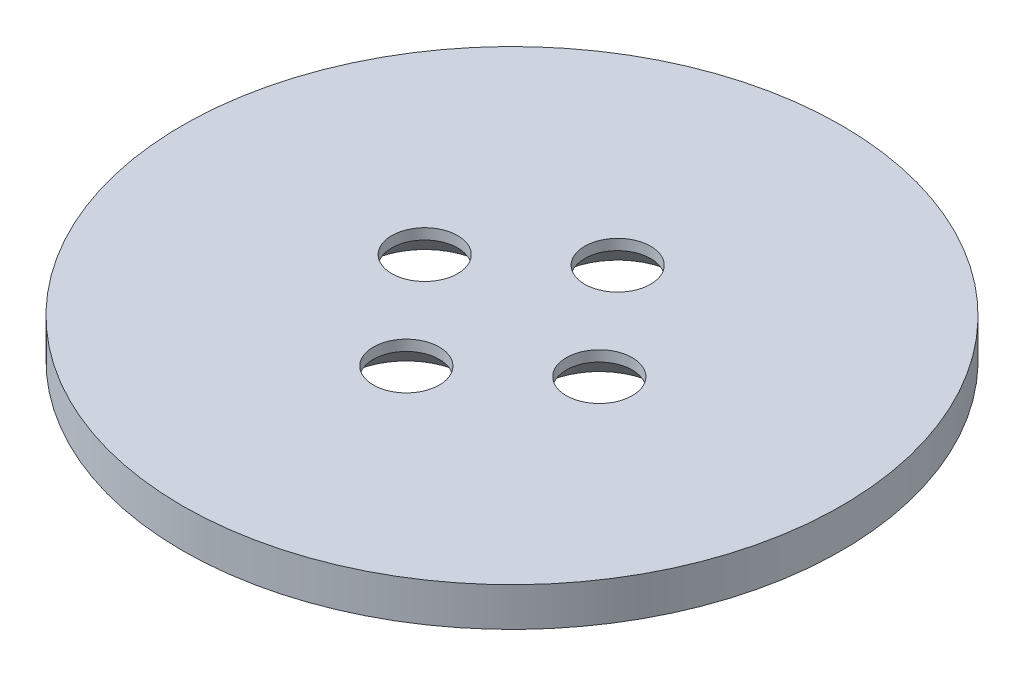
ISO-10303-21;
HEADER;
FILE_DESCRIPTION(('STEP AP214'),'2;1');
FILE_NAME('part.step','',(''),(''),'','','');
FILE_SCHEMA(('AUTOMOTIVE_DESIGN { 1 0 10303 214 1 1 1 1 }'));
ENDSEC;
DATA;
#1=APPLICATION_CONTEXT('core data for automotive mechanical design processes');
#2=APPLICATION_PROTOCOL_DEFINITION('international standard','automotive_design',2000,#1);
#3=PRODUCT_CONTEXT('',#1,'mechanical');
#4=PRODUCT('Part','Part','',(#3));
#5=PRODUCT_RELATED_PRODUCT_CATEGORY('part','',(#4));
#6=PRODUCT_DEFINITION_FORMATION('','',#4);
#7=PRODUCT_DEFINITION_CONTEXT('part definition',#1,'design');
#8=PRODUCT_DEFINITION('design','',#6,#7);
#9=PRODUCT_DEFINITION_SHAPE('','',#8);
#10=(LENGTH_UNIT() NAMED_UNIT(*) SI_UNIT(.MILLI.,.METRE.));
#11=(NAMED_UNIT(*) PLANE_ANGLE_UNIT() SI_UNIT($,.RADIAN.));
#12=(NAMED_UNIT(*) SI_UNIT($,.STERADIAN.) SOLID_ANGLE_UNIT());
#13=UNCERTAINTY_MEASURE_WITH_UNIT(LENGTH_MEASURE(1.E-05),#10,'distance_accuracy_value','');
#14=(GEOMETRIC_REPRESENTATION_CONTEXT(3) GLOBAL_UNCERTAINTY_ASSIGNED_CONTEXT((#13)) GLOBAL_UNIT_ASSIGNED_CONTEXT((#10,
#11,#12)) REPRESENTATION_CONTEXT('',''));
#15=CARTESIAN_POINT('',(0.,0.,0.));
#16=DIRECTION('',(0.,0.,1.));
#17=DIRECTION('',(1.,0.,0.));
#18=AXIS2_PLACEMENT_3D('',#15,#16,#17);
#19=CARTESIAN_POINT('',(0.,0.,0.));
#20=DIRECTION('',(0.,1.,0.));
#21=DIRECTION('',(0.,0.,1.));
#22=AXIS2_PLACEMENT_3D('',#19,#20,#21);
#23=PLANE('',#22);
#24=CARTESIAN_POINT('',(-4.97744432328981,0.,-0.474392251781201));
#25=DIRECTION('',(0.,-1.,0.));
#26=DIRECTION('',(0.,0.,-1.));
#27=AXIS2_PLACEMENT_3D('',#24,#25,#26);
#28=CIRCLE('',#27,3.15);
#29=CARTESIAN_POINT('',(-4.97744432328981,0.,-3.6243922517812));
#30=VERTEX_POINT('',#29);
#31=EDGE_CURVE('E76',#30,#30,#28,.T.);
#32=ORIENTED_EDGE('',*,*,#31,.F.);
#33=EDGE_LOOP('',(#32));
#34=FACE_BOUND('',#33,.T.);
#35=CARTESIAN_POINT('',(0.,0.,0.));
#36=DIRECTION('',(0.,1.,0.));
#37=DIRECTION('',(0.,0.,1.));
#38=AXIS2_PLACEMENT_3D('',#35,#36,#37);
#39=CIRCLE('',#38,17.);
#40=CARTESIAN_POINT('',(0.,0.,17.));
#41=VERTEX_POINT('',#40);
#42=EDGE_CURVE('E35',#41,#41,#39,.T.);
#43=ORIENTED_EDGE('',*,*,#42,.F.);
#44=EDGE_LOOP('',(#43));
#45=FACE_BOUND('',#44,.T.);
#46=CARTESIAN_POINT('',(-0.474392251781206,0.,4.97744432328982));
#47=DIRECTION('',(0.,-1.,0.));
#48=DIRECTION('',(0.,0.,-1.));
#49=AXIS2_PLACEMENT_3D('',#46,#47,#48);
#50=CIRCLE('',#49,3.15);
#51=CARTESIAN_POINT('',(-0.474392251781206,0.,1.82744432328982));
#52=VERTEX_POINT('',#51);
#53=EDGE_CURVE('E49',#52,#52,#50,.T.);
#54=ORIENTED_EDGE('',*,*,#53,.F.);
#55=EDGE_LOOP('',(#54));
#56=FACE_BOUND('',#55,.T.);
#57=CARTESIAN_POINT('',(4.97744432328982,0.,0.474392251781215));
#58=DIRECTION('',(0.,-1.,0.));
#59=DIRECTION('',(0.,0.,-1.));
#60=AXIS2_PLACEMENT_3D('',#57,#58,#59);
#61=CIRCLE('',#60,3.15);
#62=CARTESIAN_POINT('',(4.97744432328982,0.,-2.67560774821879));
#63=VERTEX_POINT('',#62);
#64=EDGE_CURVE('E58',#63,#63,#61,.T.);
#65=ORIENTED_EDGE('',*,*,#64,.F.);
#66=EDGE_LOOP('',(#65));
#67=FACE_BOUND('',#66,.T.);
#68=CARTESIAN_POINT('',(0.47439225178121,0.,-4.97744432328981));
#69=DIRECTION('',(0.,-1.,0.));
#70=DIRECTION('',(0.,0.,-1.));
#71=AXIS2_PLACEMENT_3D('',#68,#69,#70);
#72=CIRCLE('',#71,3.15);
#73=CARTESIAN_POINT('',(0.47439225178121,0.,-8.12744432328981));
#74=VERTEX_POINT('',#73);
#75=EDGE_CURVE('E67',#74,#74,#72,.T.);
#76=ORIENTED_EDGE('',*,*,#75,.F.);
#77=EDGE_LOOP('',(#76));
#78=FACE_BOUND('',#77,.T.);
#79=ADVANCED_FACE('F31',(#34,#45,#56,#67,#78),#23,.F.);
#80=CARTESIAN_POINT('',(0.,2.,0.));
#81=DIRECTION('',(0.,-1.,0.));
#82=DIRECTION('',(0.,0.,-1.));
#83=AXIS2_PLACEMENT_3D('',#80,#81,#82);
#84=CYLINDRICAL_SURFACE('',#83,17.);
#85=CARTESIAN_POINT('',(0.,2.,0.));
#86=DIRECTION('',(0.,1.,0.));
#87=DIRECTION('',(0.,0.,1.));
#88=AXIS2_PLACEMENT_3D('',#85,#86,#87);
#89=CIRCLE('',#88,17.);
#90=CARTESIAN_POINT('',(0.,2.,17.));
#91=VERTEX_POINT('',#90);
#92=EDGE_CURVE('E10',#91,#91,#89,.T.);
#93=ORIENTED_EDGE('',*,*,#92,.F.);
#94=EDGE_LOOP('',(#93));
#95=FACE_BOUND('',#94,.T.);
#96=ORIENTED_EDGE('',*,*,#42,.T.);
#97=EDGE_LOOP('',(#96));
#98=FACE_BOUND('',#97,.T.);
#99=ADVANCED_FACE('F33',(#95,#98),#84,.T.);
#100=CARTESIAN_POINT('',(0.,2.,0.));
#101=DIRECTION('',(0.,1.,0.));
#102=DIRECTION('',(0.,0.,1.));
#103=AXIS2_PLACEMENT_3D('',#100,#101,#102);
#104=PLANE('',#103);
#105=CARTESIAN_POINT('',(-4.97744432328981,2.,-0.474392251781201));
#106=DIRECTION('',(0.,1.,0.));
#107=DIRECTION('',(0.,0.,1.));
#108=AXIS2_PLACEMENT_3D('',#105,#106,#107);
#109=CIRCLE('',#108,1.7);
#110=CARTESIAN_POINT('',(-4.97744432328981,2.,1.2256077482188));
#111=VERTEX_POINT('',#110);
#112=EDGE_CURVE('E70',#111,#111,#109,.T.);
#113=ORIENTED_EDGE('',*,*,#112,.F.);
#114=EDGE_LOOP('',(#113));
#115=FACE_BOUND('',#114,.T.);
#116=CARTESIAN_POINT('',(0.47439225178121,2.,-4.97744432328981));
#117=DIRECTION('',(0.,1.,0.));
#118=DIRECTION('',(0.,0.,1.));
#119=AXIS2_PLACEMENT_3D('',#116,#117,#118);
#120=CIRCLE('',#119,1.7);
#121=CARTESIAN_POINT('',(0.47439225178121,2.,-3.27744432328981));
#122=VERTEX_POINT('',#121);
#123=EDGE_CURVE('E61',#122,#122,#120,.T.);
#124=ORIENTED_EDGE('',*,*,#123,.F.);
#125=EDGE_LOOP('',(#124));
#126=FACE_BOUND('',#125,.T.);
#127=CARTESIAN_POINT('',(4.97744432328982,2.,0.474392251781215));
#128=DIRECTION('',(0.,1.,0.));
#129=DIRECTION('',(0.,0.,1.));
#130=AXIS2_PLACEMENT_3D('',#127,#128,#129);
#131=CIRCLE('',#130,1.7);
#132=CARTESIAN_POINT('',(4.97744432328982,2.,2.17439225178121));
#133=VERTEX_POINT('',#132);
#134=EDGE_CURVE('E52',#133,#133,#131,.T.);
#135=ORIENTED_EDGE('',*,*,#134,.F.);
#136=EDGE_LOOP('',(#135));
#137=FACE_BOUND('',#136,.T.);
#138=CARTESIAN_POINT('',(-0.474392251781206,2.,4.97744432328982));
#139=DIRECTION('',(0.,1.,0.));
#140=DIRECTION('',(0.,0.,1.));
#141=AXIS2_PLACEMENT_3D('',#138,#139,#140);
#142=CIRCLE('',#141,1.7);
#143=CARTESIAN_POINT('',(-0.474392251781206,2.,6.67744432328982));
#144=VERTEX_POINT('',#143);
#145=EDGE_CURVE('E42',#144,#144,#142,.T.);
#146=ORIENTED_EDGE('',*,*,#145,.F.);
#147=EDGE_LOOP('',(#146));
#148=FACE_BOUND('',#147,.T.);
#149=ORIENTED_EDGE('',*,*,#92,.T.);
#150=EDGE_LOOP('',(#149));
#151=FACE_BOUND('',#150,.T.);
#152=ADVANCED_FACE('F124',(#115,#126,#137,#148,#151),#104,.T.);
#153=CARTESIAN_POINT('',(-0.474392251781206,0.,4.97744432328982));
#154=DIRECTION('',(0.,-1.,0.));
#155=DIRECTION('',(0.,0.,-1.));
#156=AXIS2_PLACEMENT_3D('',#153,#154,#155);
#157=CYLINDRICAL_SURFACE('',#156,1.7);
#158=CARTESIAN_POINT('',(-0.474392251781206,1.45,4.97744432328982));
#159=DIRECTION('',(0.,-1.,0.));
#160=DIRECTION('',(0.,0.,-1.));
#161=AXIS2_PLACEMENT_3D('',#158,#159,#160);
#162=CIRCLE('',#161,1.7);
#163=CARTESIAN_POINT('',(-0.474392251781206,1.45,3.27744432328982));
#164=VERTEX_POINT('',#163);
#165=EDGE_CURVE('E46',#164,#164,#162,.T.);
#166=ORIENTED_EDGE('',*,*,#165,.T.);
#167=EDGE_LOOP('',(#166));
#168=FACE_BOUND('',#167,.T.);
#169=ORIENTED_EDGE('',*,*,#145,.T.);
#170=EDGE_LOOP('',(#169));
#171=FACE_BOUND('',#170,.T.);
#172=ADVANCED_FACE('F120',(#168,#171),#157,.F.);
#173=CARTESIAN_POINT('',(-0.474392251781206,0.,4.97744432328982));
#174=DIRECTION('',(0.,-1.,0.));
#175=DIRECTION('',(0.,0.,-1.));
#176=AXIS2_PLACEMENT_3D('',#173,#174,#175);
#177=CONICAL_SURFACE('',#176,3.15,0.785398163397449);
#178=ORIENTED_EDGE('',*,*,#165,.F.);
#179=EDGE_LOOP('',(#178));
#180=FACE_BOUND('',#179,.T.);
#181=ORIENTED_EDGE('',*,*,#53,.T.);
#182=EDGE_LOOP('',(#181));
#183=FACE_BOUND('',#182,.T.);
#184=ADVANCED_FACE('F116',(#180,#183),#177,.F.);
#185=CARTESIAN_POINT('',(4.97744432328982,0.,0.474392251781215));
#186=DIRECTION('',(0.,-1.,0.));
#187=DIRECTION('',(0.,0.,-1.));
#188=AXIS2_PLACEMENT_3D('',#185,#186,#187);
#189=CYLINDRICAL_SURFACE('',#188,1.7);
#190=CARTESIAN_POINT('',(4.97744432328982,1.45,0.474392251781215));
#191=DIRECTION('',(0.,-1.,0.));
#192=DIRECTION('',(0.,0.,-1.));
#193=AXIS2_PLACEMENT_3D('',#190,#191,#192);
#194=CIRCLE('',#193,1.7);
#195=CARTESIAN_POINT('',(4.97744432328982,1.45,-1.22560774821878));
#196=VERTEX_POINT('',#195);
#197=EDGE_CURVE('E55',#196,#196,#194,.T.);
#198=ORIENTED_EDGE('',*,*,#197,.T.);
#199=EDGE_LOOP('',(#198));
#200=FACE_BOUND('',#199,.T.);
#201=ORIENTED_EDGE('',*,*,#134,.T.);
#202=EDGE_LOOP('',(#201));
#203=FACE_BOUND('',#202,.T.);
#204=ADVANCED_FACE('F112',(#200,#203),#189,.F.);
#205=CARTESIAN_POINT('',(4.97744432328982,0.,0.474392251781215));
#206=DIRECTION('',(0.,-1.,0.));
#207=DIRECTION('',(0.,0.,-1.));
#208=AXIS2_PLACEMENT_3D('',#205,#206,#207);
#209=CONICAL_SURFACE('',#208,3.15,0.785398163397449);
#210=ORIENTED_EDGE('',*,*,#197,.F.);
#211=EDGE_LOOP('',(#210));
#212=FACE_BOUND('',#211,.T.);
#213=ORIENTED_EDGE('',*,*,#64,.T.);
#214=EDGE_LOOP('',(#213));
#215=FACE_BOUND('',#214,.T.);
#216=ADVANCED_FACE('F104',(#212,#215),#209,.F.);
#217=CARTESIAN_POINT('',(0.47439225178121,0.,-4.97744432328981));
#218=DIRECTION('',(0.,-1.,0.));
#219=DIRECTION('',(0.,0.,-1.));
#220=AXIS2_PLACEMENT_3D('',#217,#218,#219);
#221=CYLINDRICAL_SURFACE('',#220,1.7);
#222=CARTESIAN_POINT('',(0.47439225178121,1.45,-4.97744432328981));
#223=DIRECTION('',(0.,-1.,0.));
#224=DIRECTION('',(0.,0.,-1.));
#225=AXIS2_PLACEMENT_3D('',#222,#223,#224);
#226=CIRCLE('',#225,1.7);
#227=CARTESIAN_POINT('',(0.47439225178121,1.45,-6.6774443232898));
#228=VERTEX_POINT('',#227);
#229=EDGE_CURVE('E64',#228,#228,#226,.T.);
#230=ORIENTED_EDGE('',*,*,#229,.T.);
#231=EDGE_LOOP('',(#230));
#232=FACE_BOUND('',#231,.T.);
#233=ORIENTED_EDGE('',*,*,#123,.T.);
#234=EDGE_LOOP('',(#233));
#235=FACE_BOUND('',#234,.T.);
#236=ADVANCED_FACE('F95',(#232,#235),#221,.F.);
#237=CARTESIAN_POINT('',(0.47439225178121,0.,-4.97744432328981));
#238=DIRECTION('',(0.,-1.,0.));
#239=DIRECTION('',(0.,0.,-1.));
#240=AXIS2_PLACEMENT_3D('',#237,#238,#239);
#241=CONICAL_SURFACE('',#240,3.15,0.785398163397449);
#242=ORIENTED_EDGE('',*,*,#229,.F.);
#243=EDGE_LOOP('',(#242));
#244=FACE_BOUND('',#243,.T.);
#245=ORIENTED_EDGE('',*,*,#75,.T.);
#246=EDGE_LOOP('',(#245));
#247=FACE_BOUND('',#246,.T.);
#248=ADVANCED_FACE('F92',(#244,#247),#241,.F.);
#249=CARTESIAN_POINT('',(-4.97744432328981,0.,-0.474392251781201));
#250=DIRECTION('',(0.,-1.,0.));
#251=DIRECTION('',(0.,0.,-1.));
#252=AXIS2_PLACEMENT_3D('',#249,#250,#251);
#253=CYLINDRICAL_SURFACE('',#252,1.7);
#254=CARTESIAN_POINT('',(-4.97744432328981,1.45,-0.474392251781201));
#255=DIRECTION('',(0.,-1.,0.));
#256=DIRECTION('',(0.,0.,-1.));
#257=AXIS2_PLACEMENT_3D('',#254,#255,#256);
#258=CIRCLE('',#257,1.7);
#259=CARTESIAN_POINT('',(-4.97744432328981,1.45,-2.1743922517812));
#260=VERTEX_POINT('',#259);
#261=EDGE_CURVE('E73',#260,#260,#258,.T.);
#262=ORIENTED_EDGE('',*,*,#261,.T.);
#263=EDGE_LOOP('',(#262));
#264=FACE_BOUND('',#263,.T.);
#265=ORIENTED_EDGE('',*,*,#112,.T.);
#266=EDGE_LOOP('',(#265));
#267=FACE_BOUND('',#266,.T.);
#268=ADVANCED_FACE('F94',(#264,#267),#253,.F.);
#269=CARTESIAN_POINT('',(-4.97744432328981,0.,-0.474392251781201));
#270=DIRECTION('',(0.,-1.,0.));
#271=DIRECTION('',(0.,0.,-1.));
#272=AXIS2_PLACEMENT_3D('',#269,#270,#271);
#273=CONICAL_SURFACE('',#272,3.15,0.785398163397449);
#274=ORIENTED_EDGE('',*,*,#261,.F.);
#275=EDGE_LOOP('',(#274));
#276=FACE_BOUND('',#275,.T.);
#277=ORIENTED_EDGE('',*,*,#31,.T.);
#278=EDGE_LOOP('',(#277));
#279=FACE_BOUND('',#278,.T.);
#280=ADVANCED_FACE('F80',(#276,#279),#273,.F.);
#281=CLOSED_SHELL('',(#79,#99,#152,#172,#184,#204,#216,#236,#248,#268,#280));
#282=MANIFOLD_SOLID_BREP('B2',#281);
#283=ADVANCED_BREP_SHAPE_REPRESENTATION('',(#18,#282),#14);
#284=SHAPE_DEFINITION_REPRESENTATION(#9,#283);
ENDSEC;
END-ISO-10303-21;
